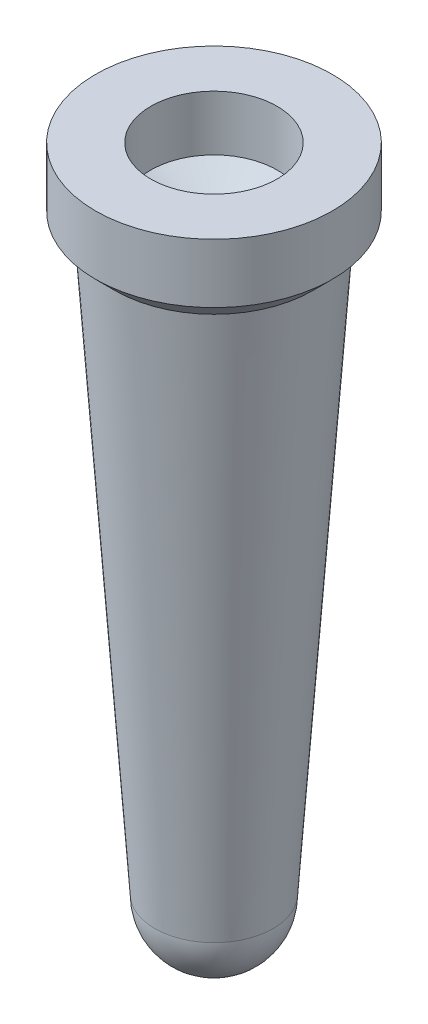
ISO-10303-21;
HEADER;
FILE_DESCRIPTION(('STEP AP214'),'2;1');
FILE_NAME('part.step','',(''),(''),'','','');
FILE_SCHEMA(('AUTOMOTIVE_DESIGN { 1 0 10303 214 1 1 1 1 }'));
ENDSEC;
DATA;
#1=APPLICATION_CONTEXT('core data for automotive mechanical design processes');
#2=APPLICATION_PROTOCOL_DEFINITION('international standard','automotive_design',2000,#1);
#3=PRODUCT_CONTEXT('',#1,'mechanical');
#4=PRODUCT('Part','Part','',(#3));
#5=PRODUCT_RELATED_PRODUCT_CATEGORY('part','',(#4));
#6=PRODUCT_DEFINITION_FORMATION('','',#4);
#7=PRODUCT_DEFINITION_CONTEXT('part definition',#1,'design');
#8=PRODUCT_DEFINITION('design','',#6,#7);
#9=PRODUCT_DEFINITION_SHAPE('','',#8);
#10=(LENGTH_UNIT() NAMED_UNIT(*) SI_UNIT(.MILLI.,.METRE.));
#11=(NAMED_UNIT(*) PLANE_ANGLE_UNIT() SI_UNIT($,.RADIAN.));
#12=(NAMED_UNIT(*) SI_UNIT($,.STERADIAN.) SOLID_ANGLE_UNIT());
#13=UNCERTAINTY_MEASURE_WITH_UNIT(LENGTH_MEASURE(1.E-05),#10,'distance_accuracy_value','');
#14=(GEOMETRIC_REPRESENTATION_CONTEXT(3) GLOBAL_UNCERTAINTY_ASSIGNED_CONTEXT((#13)) GLOBAL_UNIT_ASSIGNED_CONTEXT((#10,
#11,#12)) REPRESENTATION_CONTEXT('',''));
#15=CARTESIAN_POINT('',(0.,0.,0.));
#16=DIRECTION('',(0.,0.,1.));
#17=DIRECTION('',(1.,0.,0.));
#18=AXIS2_PLACEMENT_3D('',#15,#16,#17);
#19=CARTESIAN_POINT('',(0.,0.254,0.));
#20=DIRECTION('',(0.,-1.,0.));
#21=DIRECTION('',(0.,0.,-1.));
#22=AXIS2_PLACEMENT_3D('',#19,#20,#21);
#23=CYLINDRICAL_SURFACE('',#22,0.380999999999999);
#24=CARTESIAN_POINT('',(0.,0.0635000000000001,0.));
#25=DIRECTION('',(0.,1.,0.));
#26=DIRECTION('',(0.,0.,1.));
#27=AXIS2_PLACEMENT_3D('',#24,#25,#26);
#28=CIRCLE('',#27,0.380999999999999);
#29=CARTESIAN_POINT('',(0.,0.0635000000000001,0.380999999999999));
#30=VERTEX_POINT('',#29);
#31=EDGE_CURVE('E78',#30,#30,#28,.T.);
#32=ORIENTED_EDGE('',*,*,#31,.T.);
#33=EDGE_LOOP('',(#32));
#34=FACE_BOUND('',#33,.T.);
#35=CARTESIAN_POINT('',(0.,0.254,0.));
#36=DIRECTION('',(0.,1.,0.));
#37=DIRECTION('',(0.,0.,1.));
#38=AXIS2_PLACEMENT_3D('',#35,#36,#37);
#39=CIRCLE('',#38,0.380999999999999);
#40=CARTESIAN_POINT('',(0.,0.254,0.380999999999999));
#41=VERTEX_POINT('',#40);
#42=EDGE_CURVE('E79',#41,#41,#39,.T.);
#43=ORIENTED_EDGE('',*,*,#42,.F.);
#44=EDGE_LOOP('',(#43));
#45=FACE_BOUND('',#44,.T.);
#46=ADVANCED_FACE('F34',(#34,#45),#23,.T.);
#47=CARTESIAN_POINT('',(0.,0.254,0.));
#48=DIRECTION('',(0.,1.,0.));
#49=DIRECTION('',(0.,0.,1.));
#50=AXIS2_PLACEMENT_3D('',#47,#48,#49);
#51=PLANE('',#50);
#52=CARTESIAN_POINT('',(0.,0.254,0.));
#53=DIRECTION('',(0.,1.,0.));
#54=DIRECTION('',(0.,0.,1.));
#55=AXIS2_PLACEMENT_3D('',#52,#53,#54);
#56=CIRCLE('',#55,0.2032);
#57=CARTESIAN_POINT('',(0.,0.254,0.2032));
#58=VERTEX_POINT('',#57);
#59=EDGE_CURVE('E87',#58,#58,#56,.T.);
#60=ORIENTED_EDGE('',*,*,#59,.F.);
#61=EDGE_LOOP('',(#60));
#62=FACE_BOUND('',#61,.T.);
#63=ORIENTED_EDGE('',*,*,#42,.T.);
#64=EDGE_LOOP('',(#63));
#65=FACE_BOUND('',#64,.T.);
#66=ADVANCED_FACE('F55',(#62,#65),#51,.T.);
#67=CARTESIAN_POINT('',(0.,0.0635000000000001,0.));
#68=DIRECTION('',(0.,1.,0.));
#69=DIRECTION('',(0.,0.,1.));
#70=AXIS2_PLACEMENT_3D('',#67,#68,#69);
#71=CONICAL_SURFACE('',#70,0.380999999999999,0.78539816339745);
#72=CARTESIAN_POINT('',(0.,0.,0.));
#73=DIRECTION('',(0.,1.,0.));
#74=DIRECTION('',(0.,0.,1.));
#75=AXIS2_PLACEMENT_3D('',#72,#73,#74);
#76=CIRCLE('',#75,0.317499999999999);
#77=CARTESIAN_POINT('',(0.,0.,0.317499999999999));
#78=VERTEX_POINT('',#77);
#79=EDGE_CURVE('E41',#78,#78,#76,.F.);
#80=ORIENTED_EDGE('',*,*,#79,.F.);
#81=EDGE_LOOP('',(#80));
#82=FACE_BOUND('',#81,.T.);
#83=ORIENTED_EDGE('',*,*,#31,.F.);
#84=EDGE_LOOP('',(#83));
#85=FACE_BOUND('',#84,.T.);
#86=ADVANCED_FACE('F61',(#82,#85),#71,.T.);
#87=CARTESIAN_POINT('',(0.,-1.8415,0.));
#88=DIRECTION('',(0.,1.,0.));
#89=DIRECTION('',(0.,0.,1.));
#90=AXIS2_PLACEMENT_3D('',#87,#88,#89);
#91=SPHERICAL_SURFACE('',#90,0.1905);
#92=CARTESIAN_POINT('',(0.,-1.8415,0.));
#93=DIRECTION('',(0.,1.,0.));
#94=DIRECTION('',(0.,0.,1.));
#95=AXIS2_PLACEMENT_3D('',#92,#93,#94);
#96=CIRCLE('',#95,0.1905);
#97=CARTESIAN_POINT('',(0.,-1.8415,0.1905));
#98=VERTEX_POINT('',#97);
#99=EDGE_CURVE('E82',#98,#98,#96,.T.);
#100=ORIENTED_EDGE('',*,*,#99,.F.);
#101=EDGE_LOOP('',(#100));
#102=FACE_BOUND('',#101,.T.);
#103=ADVANCED_FACE('F68',(#102),#91,.T.);
#104=CARTESIAN_POINT('',(0.,-1.8415,0.));
#105=DIRECTION('',(0.,1.,0.));
#106=DIRECTION('',(0.,0.,1.));
#107=AXIS2_PLACEMENT_3D('',#104,#105,#106);
#108=CONICAL_SURFACE('',#107,0.1905,0.068856489301044);
#109=ORIENTED_EDGE('',*,*,#79,.T.);
#110=EDGE_LOOP('',(#109));
#111=FACE_BOUND('',#110,.T.);
#112=ORIENTED_EDGE('',*,*,#99,.T.);
#113=EDGE_LOOP('',(#112));
#114=FACE_BOUND('',#113,.T.);
#115=ADVANCED_FACE('F50',(#111,#114),#108,.T.);
#116=CARTESIAN_POINT('',(0.,0.,0.));
#117=DIRECTION('',(0.,1.,0.));
#118=DIRECTION('',(0.,0.,1.));
#119=AXIS2_PLACEMENT_3D('',#116,#117,#118);
#120=CYLINDRICAL_SURFACE('',#119,0.2032);
#121=CARTESIAN_POINT('',(0.,0.0761999999999998,0.));
#122=DIRECTION('',(0.,1.,0.));
#123=DIRECTION('',(0.,0.,1.));
#124=AXIS2_PLACEMENT_3D('',#121,#122,#123);
#125=CIRCLE('',#124,0.2032);
#126=CARTESIAN_POINT('',(0.,0.0761999999999998,0.2032));
#127=VERTEX_POINT('',#126);
#128=EDGE_CURVE('E11',#127,#127,#125,.F.);
#129=ORIENTED_EDGE('',*,*,#128,.T.);
#130=EDGE_LOOP('',(#129));
#131=FACE_BOUND('',#130,.T.);
#132=ORIENTED_EDGE('',*,*,#59,.T.);
#133=EDGE_LOOP('',(#132));
#134=FACE_BOUND('',#133,.T.);
#135=ADVANCED_FACE('F45',(#131,#134),#120,.F.);
#136=CARTESIAN_POINT('',(0.,0.0761999999999998,0.));
#137=DIRECTION('',(0.,1.,0.));
#138=DIRECTION('',(0.,0.,1.));
#139=AXIS2_PLACEMENT_3D('',#136,#137,#138);
#140=CONICAL_SURFACE('',#139,0.203200487798167,1.21202644575495);
#141=ORIENTED_EDGE('',*,*,#128,.F.);
#142=EDGE_LOOP('',(#141));
#143=FACE_BOUND('',#142,.T.);
#144=CARTESIAN_POINT('',(0.,0.,-4.87798166876746E-07));
#145=VERTEX_POINT('',#144);
#146=VERTEX_LOOP('',#145);
#147=FACE_BOUND('',#146,.T.);
#148=ADVANCED_FACE('F36',(#143,#147),#140,.F.);
#149=CLOSED_SHELL('',(#46,#66,#86,#103,#115,#135,#148));
#150=MANIFOLD_SOLID_BREP('B2',#149);
#151=ADVANCED_BREP_SHAPE_REPRESENTATION('',(#18,#150),#14);
#152=SHAPE_DEFINITION_REPRESENTATION(#9,#151);
ENDSEC;
END-ISO-10303-21;
